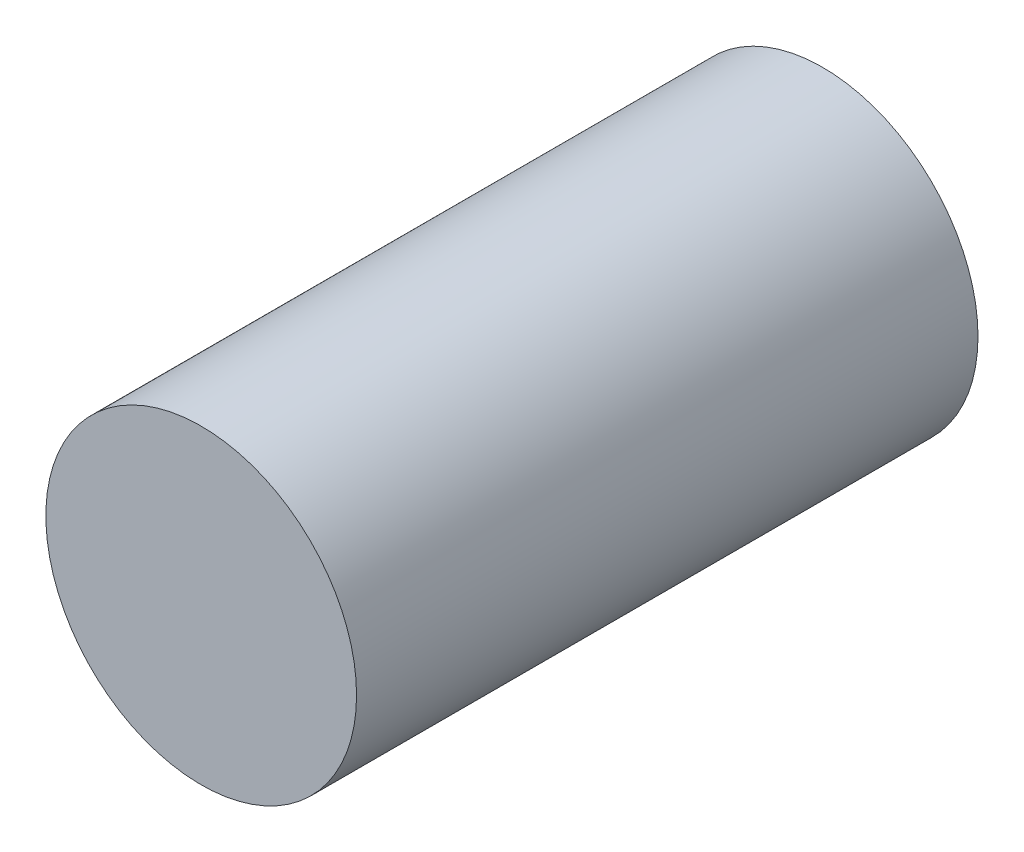
ISO-10303-21;
HEADER;
FILE_DESCRIPTION(('STEP AP214'),'2;1');
FILE_NAME('part.step','',(''),(''),'','','');
FILE_SCHEMA(('AUTOMOTIVE_DESIGN { 1 0 10303 214 1 1 1 1 }'));
ENDSEC;
DATA;
#1=APPLICATION_CONTEXT('core data for automotive mechanical design processes');
#2=APPLICATION_PROTOCOL_DEFINITION('international standard','automotive_design',2000,#1);
#3=PRODUCT_CONTEXT('',#1,'mechanical');
#4=PRODUCT('Part','Part','',(#3));
#5=PRODUCT_RELATED_PRODUCT_CATEGORY('part','',(#4));
#6=PRODUCT_DEFINITION_FORMATION('','',#4);
#7=PRODUCT_DEFINITION_CONTEXT('part definition',#1,'design');
#8=PRODUCT_DEFINITION('design','',#6,#7);
#9=PRODUCT_DEFINITION_SHAPE('','',#8);
#10=(LENGTH_UNIT() NAMED_UNIT(*) SI_UNIT(.MILLI.,.METRE.));
#11=(NAMED_UNIT(*) PLANE_ANGLE_UNIT() SI_UNIT($,.RADIAN.));
#12=(NAMED_UNIT(*) SI_UNIT($,.STERADIAN.) SOLID_ANGLE_UNIT());
#13=UNCERTAINTY_MEASURE_WITH_UNIT(LENGTH_MEASURE(1.E-05),#10,'distance_accuracy_value','');
#14=(GEOMETRIC_REPRESENTATION_CONTEXT(3) GLOBAL_UNCERTAINTY_ASSIGNED_CONTEXT((#13)) GLOBAL_UNIT_ASSIGNED_CONTEXT((#10,
#11,#12)) REPRESENTATION_CONTEXT('',''));
#15=CARTESIAN_POINT('',(0.,0.,0.));
#16=DIRECTION('',(0.,0.,1.));
#17=DIRECTION('',(1.,0.,0.));
#18=AXIS2_PLACEMENT_3D('',#15,#16,#17);
#19=CARTESIAN_POINT('',(0.,0.,10.));
#20=DIRECTION('',(0.,0.,-1.));
#21=DIRECTION('',(-1.,0.,0.));
#22=AXIS2_PLACEMENT_3D('',#19,#20,#21);
#23=CYLINDRICAL_SURFACE('',#22,2.5);
#24=CARTESIAN_POINT('',(0.,0.,10.));
#25=DIRECTION('',(0.,0.,1.));
#26=DIRECTION('',(1.,0.,0.));
#27=AXIS2_PLACEMENT_3D('',#24,#25,#26);
#28=CIRCLE('',#27,2.5);
#29=CARTESIAN_POINT('',(2.5,0.,10.));
#30=VERTEX_POINT('',#29);
#31=EDGE_CURVE('E11',#30,#30,#28,.T.);
#32=ORIENTED_EDGE('',*,*,#31,.F.);
#33=EDGE_LOOP('',(#32));
#34=FACE_BOUND('',#33,.T.);
#35=CARTESIAN_POINT('',(0.,0.,0.));
#36=DIRECTION('',(0.,0.,1.));
#37=DIRECTION('',(1.,0.,0.));
#38=AXIS2_PLACEMENT_3D('',#35,#36,#37);
#39=CIRCLE('',#38,2.5);
#40=CARTESIAN_POINT('',(2.5,0.,0.));
#41=VERTEX_POINT('',#40);
#42=EDGE_CURVE('E48',#41,#41,#39,.T.);
#43=ORIENTED_EDGE('',*,*,#42,.T.);
#44=EDGE_LOOP('',(#43));
#45=FACE_BOUND('',#44,.T.);
#46=ADVANCED_FACE('F45',(#34,#45),#23,.T.);
#47=CARTESIAN_POINT('',(0.,0.,10.));
#48=DIRECTION('',(0.,0.,1.));
#49=DIRECTION('',(1.,0.,0.));
#50=AXIS2_PLACEMENT_3D('',#47,#48,#49);
#51=PLANE('',#50);
#52=ORIENTED_EDGE('',*,*,#31,.T.);
#53=EDGE_LOOP('',(#52));
#54=FACE_BOUND('',#53,.T.);
#55=ADVANCED_FACE('F105',(#54),#51,.T.);
#56=CARTESIAN_POINT('',(0.,0.,0.));
#57=DIRECTION('',(0.,0.,1.));
#58=DIRECTION('',(1.,0.,0.));
#59=AXIS2_PLACEMENT_3D('',#56,#57,#58);
#60=PLANE('',#59);
#61=DIRECTION('',(1.,0.,0.));
#62=VECTOR('',#61,1.);
#63=CARTESIAN_POINT('',(1.03663542289466,1.254,0.));
#64=LINE('',#63,#62);
#65=CARTESIAN_POINT('',(-1.03663542289466,1.254,0.));
#66=VERTEX_POINT('',#65);
#67=CARTESIAN_POINT('',(1.03663542289466,1.254,0.));
#68=VERTEX_POINT('',#67);
#69=EDGE_CURVE('E80',#66,#68,#64,.T.);
#70=ORIENTED_EDGE('',*,*,#69,.F.);
#71=CARTESIAN_POINT('',(0.,0.,0.));
#72=DIRECTION('',(0.,0.,-1.));
#73=DIRECTION('',(-1.,0.,0.));
#74=AXIS2_PLACEMENT_3D('',#71,#72,#73);
#75=CIRCLE('',#74,1.627);
#76=EDGE_CURVE('E60',#68,#66,#75,.T.);
#77=ORIENTED_EDGE('',*,*,#76,.F.);
#78=EDGE_LOOP('',(#70,#77));
#79=FACE_BOUND('',#78,.T.);
#80=ORIENTED_EDGE('',*,*,#42,.F.);
#81=EDGE_LOOP('',(#80));
#82=FACE_BOUND('',#81,.T.);
#83=ADVANCED_FACE('F85',(#79,#82),#60,.F.);
#84=CARTESIAN_POINT('',(0.,0.,9.));
#85=DIRECTION('',(0.,0.,-1.));
#86=DIRECTION('',(-1.,0.,0.));
#87=AXIS2_PLACEMENT_3D('',#84,#85,#86);
#88=CYLINDRICAL_SURFACE('',#87,1.627);
#89=ORIENTED_EDGE('',*,*,#76,.T.);
#90=DIRECTION('',(0.,0.,-1.));
#91=VECTOR('',#90,1.);
#92=CARTESIAN_POINT('',(-1.03663542289466,1.254,9.));
#93=LINE('',#92,#91);
#94=CARTESIAN_POINT('',(-1.03663542289466,1.254,9.));
#95=VERTEX_POINT('',#94);
#96=EDGE_CURVE('E77',#95,#66,#93,.T.);
#97=ORIENTED_EDGE('',*,*,#96,.F.);
#98=CARTESIAN_POINT('',(0.,0.,9.));
#99=DIRECTION('',(0.,0.,-1.));
#100=DIRECTION('',(-1.,0.,0.));
#101=AXIS2_PLACEMENT_3D('',#98,#99,#100);
#102=CIRCLE('',#101,1.627);
#103=CARTESIAN_POINT('',(1.03663542289466,1.254,9.));
#104=VERTEX_POINT('',#103);
#105=EDGE_CURVE('E74',#104,#95,#102,.T.);
#106=ORIENTED_EDGE('',*,*,#105,.F.);
#107=DIRECTION('',(0.,0.,-1.));
#108=VECTOR('',#107,1.);
#109=CARTESIAN_POINT('',(1.03663542289466,1.254,9.));
#110=LINE('',#109,#108);
#111=EDGE_CURVE('E68',#104,#68,#110,.T.);
#112=ORIENTED_EDGE('',*,*,#111,.T.);
#113=EDGE_LOOP('',(#89,#97,#106,#112));
#114=FACE_BOUND('',#113,.T.);
#115=ADVANCED_FACE('F72',(#114),#88,.F.);
#116=CARTESIAN_POINT('',(1.03663542289466,1.254,9.));
#117=DIRECTION('',(0.,1.,0.));
#118=DIRECTION('',(0.,0.,1.));
#119=AXIS2_PLACEMENT_3D('',#116,#117,#118);
#120=PLANE('',#119);
#121=ORIENTED_EDGE('',*,*,#69,.T.);
#122=ORIENTED_EDGE('',*,*,#111,.F.);
#123=DIRECTION('',(1.,0.,0.));
#124=VECTOR('',#123,1.);
#125=CARTESIAN_POINT('',(1.03663542289466,1.254,9.));
#126=LINE('',#125,#124);
#127=EDGE_CURVE('E90',#95,#104,#126,.T.);
#128=ORIENTED_EDGE('',*,*,#127,.F.);
#129=ORIENTED_EDGE('',*,*,#96,.T.);
#130=EDGE_LOOP('',(#121,#122,#128,#129));
#131=FACE_BOUND('',#130,.T.);
#132=ADVANCED_FACE('F81',(#131),#120,.F.);
#133=CARTESIAN_POINT('',(0.,0.,9.));
#134=DIRECTION('',(0.,0.,-1.));
#135=DIRECTION('',(-1.,0.,0.));
#136=AXIS2_PLACEMENT_3D('',#133,#134,#135);
#137=PLANE('',#136);
#138=ORIENTED_EDGE('',*,*,#105,.T.);
#139=ORIENTED_EDGE('',*,*,#127,.T.);
#140=EDGE_LOOP('',(#138,#139));
#141=FACE_BOUND('',#140,.T.);
#142=ADVANCED_FACE('F97',(#141),#137,.T.);
#143=CLOSED_SHELL('',(#46,#55,#83,#115,#132,#142));
#144=MANIFOLD_SOLID_BREP('B2',#143);
#145=ADVANCED_BREP_SHAPE_REPRESENTATION('',(#18,#144),#14);
#146=SHAPE_DEFINITION_REPRESENTATION(#9,#145);
ENDSEC;
END-ISO-10303-21;
